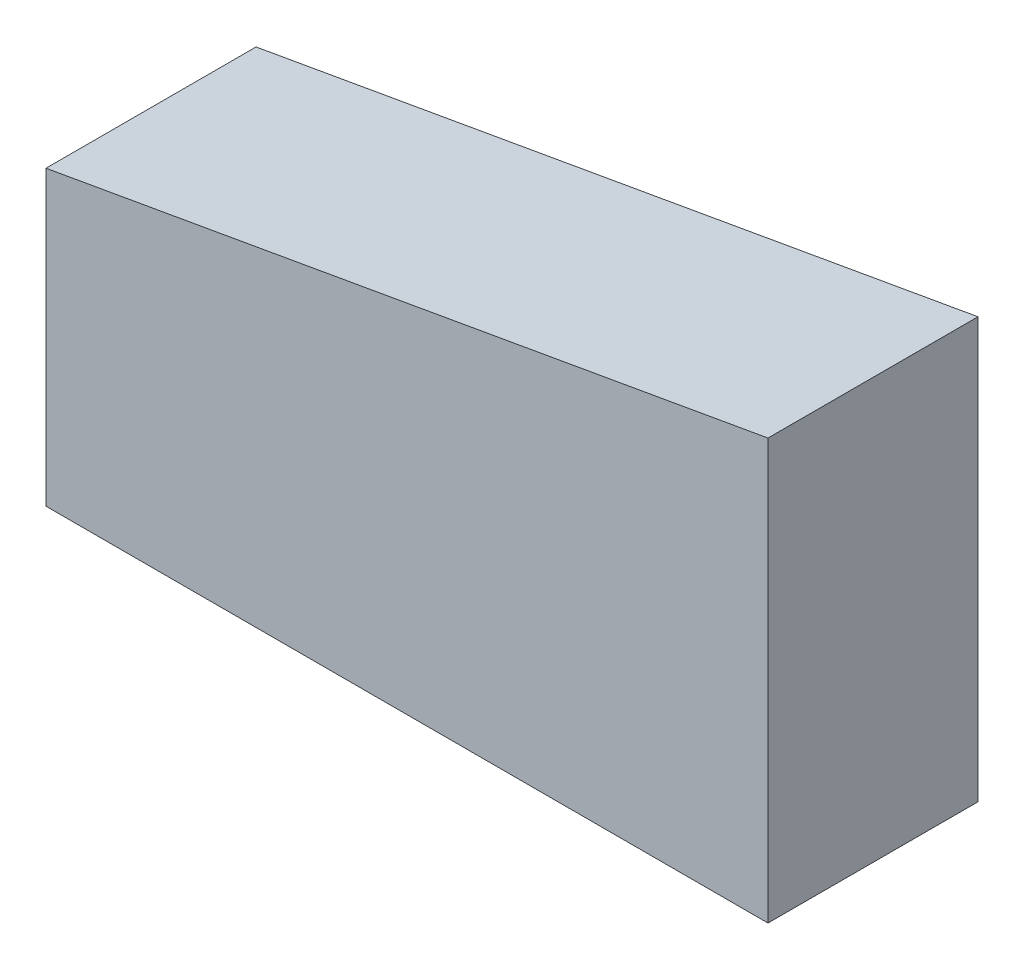
ISO-10303-21;
HEADER;
FILE_DESCRIPTION(('STEP AP214'),'2;1');
FILE_NAME('part.step','',(''),(''),'','','');
FILE_SCHEMA(('AUTOMOTIVE_DESIGN { 1 0 10303 214 1 1 1 1 }'));
ENDSEC;
DATA;
#1=APPLICATION_CONTEXT('core data for automotive mechanical design processes');
#2=APPLICATION_PROTOCOL_DEFINITION('international standard','automotive_design',2000,#1);
#3=PRODUCT_CONTEXT('',#1,'mechanical');
#4=PRODUCT('Part','Part','',(#3));
#5=PRODUCT_RELATED_PRODUCT_CATEGORY('part','',(#4));
#6=PRODUCT_DEFINITION_FORMATION('','',#4);
#7=PRODUCT_DEFINITION_CONTEXT('part definition',#1,'design');
#8=PRODUCT_DEFINITION('design','',#6,#7);
#9=PRODUCT_DEFINITION_SHAPE('','',#8);
#10=(LENGTH_UNIT() NAMED_UNIT(*) SI_UNIT(.MILLI.,.METRE.));
#11=(NAMED_UNIT(*) PLANE_ANGLE_UNIT() SI_UNIT($,.RADIAN.));
#12=(NAMED_UNIT(*) SI_UNIT($,.STERADIAN.) SOLID_ANGLE_UNIT());
#13=UNCERTAINTY_MEASURE_WITH_UNIT(LENGTH_MEASURE(1.E-05),#10,'distance_accuracy_value','');
#14=(GEOMETRIC_REPRESENTATION_CONTEXT(3) GLOBAL_UNCERTAINTY_ASSIGNED_CONTEXT((#13)) GLOBAL_UNIT_ASSIGNED_CONTEXT((#10,
#11,#12)) REPRESENTATION_CONTEXT('',''));
#15=CARTESIAN_POINT('',(0.,0.,0.));
#16=DIRECTION('',(0.,0.,1.));
#17=DIRECTION('',(1.,0.,0.));
#18=AXIS2_PLACEMENT_3D('',#15,#16,#17);
#19=CARTESIAN_POINT('',(0.,32.,16.));
#20=DIRECTION('',(-1.,0.,0.));
#21=DIRECTION('',(0.,0.,1.));
#22=AXIS2_PLACEMENT_3D('',#19,#20,#21);
#23=PLANE('',#22);
#24=DIRECTION('',(0.,1.,0.));
#25=VECTOR('',#24,1.);
#26=CARTESIAN_POINT('',(0.,32.,0.));
#27=LINE('',#26,#25);
#28=CARTESIAN_POINT('',(0.,0.,0.));
#29=VERTEX_POINT('',#28);
#30=CARTESIAN_POINT('',(0.,32.,0.));
#31=VERTEX_POINT('',#30);
#32=EDGE_CURVE('E96',#29,#31,#27,.T.);
#33=ORIENTED_EDGE('',*,*,#32,.T.);
#34=DIRECTION('',(0.,0.,-1.));
#35=VECTOR('',#34,1.);
#36=CARTESIAN_POINT('',(0.,32.,16.));
#37=LINE('',#36,#35);
#38=CARTESIAN_POINT('',(0.,32.,16.));
#39=VERTEX_POINT('',#38);
#40=EDGE_CURVE('E11',#39,#31,#37,.T.);
#41=ORIENTED_EDGE('',*,*,#40,.F.);
#42=DIRECTION('',(0.,1.,0.));
#43=VECTOR('',#42,1.);
#44=CARTESIAN_POINT('',(0.,32.,16.));
#45=LINE('',#44,#43);
#46=CARTESIAN_POINT('',(0.,0.,16.));
#47=VERTEX_POINT('',#46);
#48=EDGE_CURVE('E84',#47,#39,#45,.T.);
#49=ORIENTED_EDGE('',*,*,#48,.F.);
#50=DIRECTION('',(0.,0.,-1.));
#51=VECTOR('',#50,1.);
#52=CARTESIAN_POINT('',(0.,0.,16.));
#53=LINE('',#52,#51);
#54=EDGE_CURVE('E92',#47,#29,#53,.T.);
#55=ORIENTED_EDGE('',*,*,#54,.T.);
#56=EDGE_LOOP('',(#33,#41,#49,#55));
#57=FACE_BOUND('',#56,.T.);
#58=ADVANCED_FACE('F33',(#57),#23,.F.);
#59=CARTESIAN_POINT('',(-55.,22.3020160610346,16.));
#60=DIRECTION('',(0.173648177666927,-0.984807753012209,0.));
#61=DIRECTION('',(0.984807753012209,0.173648177666927,0.));
#62=AXIS2_PLACEMENT_3D('',#59,#60,#61);
#63=PLANE('',#62);
#64=DIRECTION('',(-0.984807753012209,-0.173648177666927,0.));
#65=VECTOR('',#64,1.);
#66=CARTESIAN_POINT('',(-55.,22.3020160610346,0.));
#67=LINE('',#66,#65);
#68=CARTESIAN_POINT('',(-55.,22.3020160610346,0.));
#69=VERTEX_POINT('',#68);
#70=EDGE_CURVE('E88',#31,#69,#67,.T.);
#71=ORIENTED_EDGE('',*,*,#70,.T.);
#72=DIRECTION('',(0.,0.,-1.));
#73=VECTOR('',#72,1.);
#74=CARTESIAN_POINT('',(-55.,22.3020160610346,16.));
#75=LINE('',#74,#73);
#76=CARTESIAN_POINT('',(-55.,22.3020160610346,16.));
#77=VERTEX_POINT('',#76);
#78=EDGE_CURVE('E41',#77,#69,#75,.T.);
#79=ORIENTED_EDGE('',*,*,#78,.F.);
#80=DIRECTION('',(-0.984807753012209,-0.173648177666927,0.));
#81=VECTOR('',#80,1.);
#82=CARTESIAN_POINT('',(-55.,22.3020160610346,16.));
#83=LINE('',#82,#81);
#84=EDGE_CURVE('E79',#39,#77,#83,.T.);
#85=ORIENTED_EDGE('',*,*,#84,.F.);
#86=ORIENTED_EDGE('',*,*,#40,.T.);
#87=EDGE_LOOP('',(#71,#79,#85,#86));
#88=FACE_BOUND('',#87,.T.);
#89=ADVANCED_FACE('F87',(#88),#63,.F.);
#90=CARTESIAN_POINT('',(-55.,0.,16.));
#91=DIRECTION('',(1.,0.,0.));
#92=DIRECTION('',(0.,0.,-1.));
#93=AXIS2_PLACEMENT_3D('',#90,#91,#92);
#94=PLANE('',#93);
#95=DIRECTION('',(0.,-1.,0.));
#96=VECTOR('',#95,1.);
#97=CARTESIAN_POINT('',(-55.,0.,0.));
#98=LINE('',#97,#96);
#99=CARTESIAN_POINT('',(-55.,0.,0.));
#100=VERTEX_POINT('',#99);
#101=EDGE_CURVE('E66',#69,#100,#98,.T.);
#102=ORIENTED_EDGE('',*,*,#101,.T.);
#103=DIRECTION('',(0.,0.,-1.));
#104=VECTOR('',#103,1.);
#105=CARTESIAN_POINT('',(-55.,0.,16.));
#106=LINE('',#105,#104);
#107=CARTESIAN_POINT('',(-55.,0.,16.));
#108=VERTEX_POINT('',#107);
#109=EDGE_CURVE('E89',#108,#100,#106,.T.);
#110=ORIENTED_EDGE('',*,*,#109,.F.);
#111=DIRECTION('',(0.,-1.,0.));
#112=VECTOR('',#111,1.);
#113=CARTESIAN_POINT('',(-55.,0.,16.));
#114=LINE('',#113,#112);
#115=EDGE_CURVE('E82',#77,#108,#114,.T.);
#116=ORIENTED_EDGE('',*,*,#115,.F.);
#117=ORIENTED_EDGE('',*,*,#78,.T.);
#118=EDGE_LOOP('',(#102,#110,#116,#117));
#119=FACE_BOUND('',#118,.T.);
#120=ADVANCED_FACE('F90',(#119),#94,.F.);
#121=CARTESIAN_POINT('',(0.,0.,16.));
#122=DIRECTION('',(0.,1.,0.));
#123=DIRECTION('',(-1.,0.,0.));
#124=AXIS2_PLACEMENT_3D('',#121,#122,#123);
#125=PLANE('',#124);
#126=DIRECTION('',(1.,0.,0.));
#127=VECTOR('',#126,1.);
#128=CARTESIAN_POINT('',(0.,0.,0.));
#129=LINE('',#128,#127);
#130=EDGE_CURVE('E72',#100,#29,#129,.T.);
#131=ORIENTED_EDGE('',*,*,#130,.T.);
#132=ORIENTED_EDGE('',*,*,#54,.F.);
#133=DIRECTION('',(1.,0.,0.));
#134=VECTOR('',#133,1.);
#135=CARTESIAN_POINT('',(0.,0.,16.));
#136=LINE('',#135,#134);
#137=EDGE_CURVE('E49',#108,#47,#136,.T.);
#138=ORIENTED_EDGE('',*,*,#137,.F.);
#139=ORIENTED_EDGE('',*,*,#109,.T.);
#140=EDGE_LOOP('',(#131,#132,#138,#139));
#141=FACE_BOUND('',#140,.T.);
#142=ADVANCED_FACE('F103',(#141),#125,.F.);
#143=CARTESIAN_POINT('',(0.,0.,16.));
#144=DIRECTION('',(0.,0.,-1.));
#145=DIRECTION('',(-1.,0.,0.));
#146=AXIS2_PLACEMENT_3D('',#143,#144,#145);
#147=PLANE('',#146);
#148=ORIENTED_EDGE('',*,*,#48,.T.);
#149=ORIENTED_EDGE('',*,*,#84,.T.);
#150=ORIENTED_EDGE('',*,*,#115,.T.);
#151=ORIENTED_EDGE('',*,*,#137,.T.);
#152=EDGE_LOOP('',(#148,#149,#150,#151));
#153=FACE_BOUND('',#152,.T.);
#154=ADVANCED_FACE('F80',(#153),#147,.F.);
#155=CARTESIAN_POINT('',(0.,0.,0.));
#156=DIRECTION('',(0.,0.,-1.));
#157=DIRECTION('',(-1.,0.,0.));
#158=AXIS2_PLACEMENT_3D('',#155,#156,#157);
#159=PLANE('',#158);
#160=ORIENTED_EDGE('',*,*,#32,.F.);
#161=ORIENTED_EDGE('',*,*,#130,.F.);
#162=ORIENTED_EDGE('',*,*,#101,.F.);
#163=ORIENTED_EDGE('',*,*,#70,.F.);
#164=EDGE_LOOP('',(#160,#161,#162,#163));
#165=FACE_BOUND('',#164,.T.);
#166=ADVANCED_FACE('F106',(#165),#159,.T.);
#167=CLOSED_SHELL('',(#58,#89,#120,#142,#154,#166));
#168=MANIFOLD_SOLID_BREP('B2',#167);
#169=ADVANCED_BREP_SHAPE_REPRESENTATION('',(#18,#168),#14);
#170=SHAPE_DEFINITION_REPRESENTATION(#9,#169);
ENDSEC;
END-ISO-10303-21;
